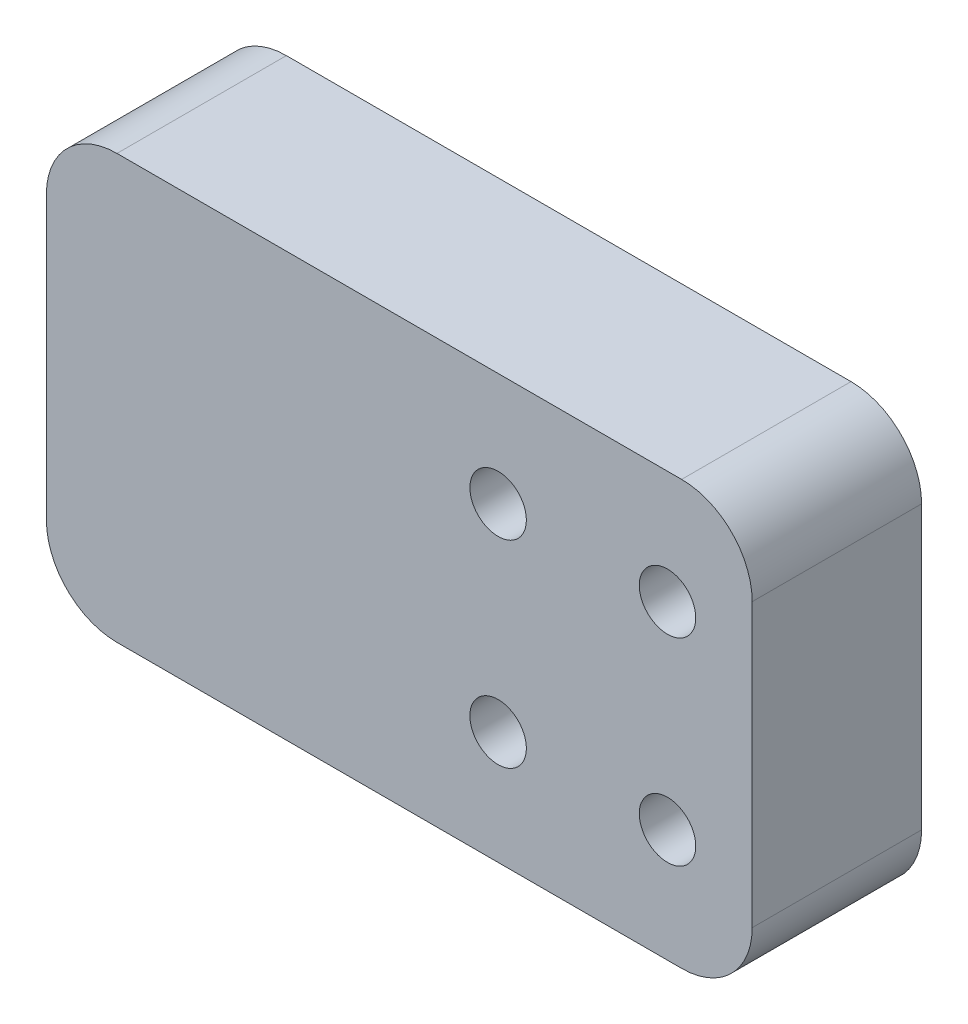
ISO-10303-21;
HEADER;
FILE_DESCRIPTION(('STEP AP214'),'2;1');
FILE_NAME('part.step','',(''),(''),'','','');
FILE_SCHEMA(('AUTOMOTIVE_DESIGN { 1 0 10303 214 1 1 1 1 }'));
ENDSEC;
DATA;
#1=APPLICATION_CONTEXT('core data for automotive mechanical design processes');
#2=APPLICATION_PROTOCOL_DEFINITION('international standard','automotive_design',2000,#1);
#3=PRODUCT_CONTEXT('',#1,'mechanical');
#4=PRODUCT('Part','Part','',(#3));
#5=PRODUCT_RELATED_PRODUCT_CATEGORY('part','',(#4));
#6=PRODUCT_DEFINITION_FORMATION('','',#4);
#7=PRODUCT_DEFINITION_CONTEXT('part definition',#1,'design');
#8=PRODUCT_DEFINITION('design','',#6,#7);
#9=PRODUCT_DEFINITION_SHAPE('','',#8);
#10=(LENGTH_UNIT() NAMED_UNIT(*) SI_UNIT(.MILLI.,.METRE.));
#11=(NAMED_UNIT(*) PLANE_ANGLE_UNIT() SI_UNIT($,.RADIAN.));
#12=(NAMED_UNIT(*) SI_UNIT($,.STERADIAN.) SOLID_ANGLE_UNIT());
#13=UNCERTAINTY_MEASURE_WITH_UNIT(LENGTH_MEASURE(1.E-05),#10,'distance_accuracy_value','');
#14=(GEOMETRIC_REPRESENTATION_CONTEXT(3) GLOBAL_UNCERTAINTY_ASSIGNED_CONTEXT((#13)) GLOBAL_UNIT_ASSIGNED_CONTEXT((#10,
#11,#12)) REPRESENTATION_CONTEXT('',''));
#15=CARTESIAN_POINT('',(0.,0.,0.));
#16=DIRECTION('',(0.,0.,1.));
#17=DIRECTION('',(1.,0.,0.));
#18=AXIS2_PLACEMENT_3D('',#15,#16,#17);
#19=CARTESIAN_POINT('',(0.,0.,-12.));
#20=DIRECTION('',(-1.,0.,0.));
#21=DIRECTION('',(0.,-1.,0.));
#22=AXIS2_PLACEMENT_3D('',#19,#20,#21);
#23=PLANE('',#22);
#24=DIRECTION('',(0.,-1.,0.));
#25=VECTOR('',#24,1.);
#26=CARTESIAN_POINT('',(0.,0.,-12.));
#27=LINE('',#26,#25);
#28=CARTESIAN_POINT('',(0.,25.,-12.));
#29=VERTEX_POINT('',#28);
#30=CARTESIAN_POINT('',(0.,5.,-12.));
#31=VERTEX_POINT('',#30);
#32=EDGE_CURVE('E172',#29,#31,#27,.T.);
#33=ORIENTED_EDGE('',*,*,#32,.T.);
#34=DIRECTION('',(0.,0.,1.));
#35=VECTOR('',#34,1.);
#36=CARTESIAN_POINT('',(0.,5.,-12.));
#37=LINE('',#36,#35);
#38=CARTESIAN_POINT('',(0.,5.,0.));
#39=VERTEX_POINT('',#38);
#40=EDGE_CURVE('E126',#31,#39,#37,.T.);
#41=ORIENTED_EDGE('',*,*,#40,.T.);
#42=DIRECTION('',(0.,-1.,0.));
#43=VECTOR('',#42,1.);
#44=CARTESIAN_POINT('',(0.,0.,0.));
#45=LINE('',#44,#43);
#46=CARTESIAN_POINT('',(0.,25.,0.));
#47=VERTEX_POINT('',#46);
#48=EDGE_CURVE('E110',#47,#39,#45,.T.);
#49=ORIENTED_EDGE('',*,*,#48,.F.);
#50=DIRECTION('',(0.,0.,1.));
#51=VECTOR('',#50,1.);
#52=CARTESIAN_POINT('',(0.,25.,-12.));
#53=LINE('',#52,#51);
#54=EDGE_CURVE('E123',#47,#29,#53,.F.);
#55=ORIENTED_EDGE('',*,*,#54,.T.);
#56=EDGE_LOOP('',(#33,#41,#49,#55));
#57=FACE_BOUND('',#56,.T.);
#58=ADVANCED_FACE('F41',(#57),#23,.T.);
#59=CARTESIAN_POINT('',(0.,30.,-12.));
#60=DIRECTION('',(0.,1.,0.));
#61=DIRECTION('',(0.,0.,1.));
#62=AXIS2_PLACEMENT_3D('',#59,#60,#61);
#63=PLANE('',#62);
#64=DIRECTION('',(-1.,0.,0.));
#65=VECTOR('',#64,1.);
#66=CARTESIAN_POINT('',(0.,30.,0.));
#67=LINE('',#66,#65);
#68=CARTESIAN_POINT('',(45.,30.,0.));
#69=VERTEX_POINT('',#68);
#70=CARTESIAN_POINT('',(4.99999999999999,30.,0.));
#71=VERTEX_POINT('',#70);
#72=EDGE_CURVE('E112',#69,#71,#67,.T.);
#73=ORIENTED_EDGE('',*,*,#72,.F.);
#74=DIRECTION('',(0.,0.,1.));
#75=VECTOR('',#74,1.);
#76=CARTESIAN_POINT('',(45.,30.,-12.));
#77=LINE('',#76,#75);
#78=CARTESIAN_POINT('',(45.,30.,-12.));
#79=VERTEX_POINT('',#78);
#80=EDGE_CURVE('E11',#69,#79,#77,.F.);
#81=ORIENTED_EDGE('',*,*,#80,.T.);
#82=DIRECTION('',(-1.,0.,0.));
#83=VECTOR('',#82,1.);
#84=CARTESIAN_POINT('',(0.,30.,-12.));
#85=LINE('',#84,#83);
#86=CARTESIAN_POINT('',(4.99999999999999,30.,-12.));
#87=VERTEX_POINT('',#86);
#88=EDGE_CURVE('E133',#79,#87,#85,.T.);
#89=ORIENTED_EDGE('',*,*,#88,.T.);
#90=DIRECTION('',(0.,0.,1.));
#91=VECTOR('',#90,1.);
#92=CARTESIAN_POINT('',(4.99999999999999,30.,-12.));
#93=LINE('',#92,#91);
#94=EDGE_CURVE('E49',#87,#71,#93,.T.);
#95=ORIENTED_EDGE('',*,*,#94,.T.);
#96=EDGE_LOOP('',(#73,#81,#89,#95));
#97=FACE_BOUND('',#96,.T.);
#98=ADVANCED_FACE('F161',(#97),#63,.T.);
#99=CARTESIAN_POINT('',(50.,0.,-12.));
#100=DIRECTION('',(1.,0.,0.));
#101=DIRECTION('',(0.,1.,0.));
#102=AXIS2_PLACEMENT_3D('',#99,#100,#101);
#103=PLANE('',#102);
#104=DIRECTION('',(0.,1.,0.));
#105=VECTOR('',#104,1.);
#106=CARTESIAN_POINT('',(50.,0.,-12.));
#107=LINE('',#106,#105);
#108=CARTESIAN_POINT('',(50.,5.,-12.));
#109=VERTEX_POINT('',#108);
#110=CARTESIAN_POINT('',(50.,25.,-12.));
#111=VERTEX_POINT('',#110);
#112=EDGE_CURVE('E137',#109,#111,#107,.T.);
#113=ORIENTED_EDGE('',*,*,#112,.T.);
#114=DIRECTION('',(0.,0.,1.));
#115=VECTOR('',#114,1.);
#116=CARTESIAN_POINT('',(50.,25.,-12.));
#117=LINE('',#116,#115);
#118=CARTESIAN_POINT('',(50.,25.,0.));
#119=VERTEX_POINT('',#118);
#120=EDGE_CURVE('E158',#111,#119,#117,.T.);
#121=ORIENTED_EDGE('',*,*,#120,.T.);
#122=DIRECTION('',(0.,1.,0.));
#123=VECTOR('',#122,1.);
#124=CARTESIAN_POINT('',(50.,0.,0.));
#125=LINE('',#124,#123);
#126=CARTESIAN_POINT('',(50.,5.,0.));
#127=VERTEX_POINT('',#126);
#128=EDGE_CURVE('E170',#127,#119,#125,.T.);
#129=ORIENTED_EDGE('',*,*,#128,.F.);
#130=DIRECTION('',(0.,0.,1.));
#131=VECTOR('',#130,1.);
#132=CARTESIAN_POINT('',(50.,5.,-12.));
#133=LINE('',#132,#131);
#134=EDGE_CURVE('E63',#127,#109,#133,.F.);
#135=ORIENTED_EDGE('',*,*,#134,.T.);
#136=EDGE_LOOP('',(#113,#121,#129,#135));
#137=FACE_BOUND('',#136,.T.);
#138=ADVANCED_FACE('F169',(#137),#103,.T.);
#139=CARTESIAN_POINT('',(0.,0.,-12.));
#140=DIRECTION('',(0.,-1.,0.));
#141=DIRECTION('',(0.,0.,-1.));
#142=AXIS2_PLACEMENT_3D('',#139,#140,#141);
#143=PLANE('',#142);
#144=DIRECTION('',(1.,0.,0.));
#145=VECTOR('',#144,1.);
#146=CARTESIAN_POINT('',(0.,0.,0.));
#147=LINE('',#146,#145);
#148=CARTESIAN_POINT('',(5.,0.,0.));
#149=VERTEX_POINT('',#148);
#150=CARTESIAN_POINT('',(45.,0.,0.));
#151=VERTEX_POINT('',#150);
#152=EDGE_CURVE('E127',#149,#151,#147,.T.);
#153=ORIENTED_EDGE('',*,*,#152,.F.);
#154=DIRECTION('',(0.,0.,1.));
#155=VECTOR('',#154,1.);
#156=CARTESIAN_POINT('',(5.,0.,-12.));
#157=LINE('',#156,#155);
#158=CARTESIAN_POINT('',(5.,0.,-12.));
#159=VERTEX_POINT('',#158);
#160=EDGE_CURVE('E149',#149,#159,#157,.F.);
#161=ORIENTED_EDGE('',*,*,#160,.T.);
#162=DIRECTION('',(1.,0.,0.));
#163=VECTOR('',#162,1.);
#164=CARTESIAN_POINT('',(0.,0.,-12.));
#165=LINE('',#164,#163);
#166=CARTESIAN_POINT('',(45.,0.,-12.));
#167=VERTEX_POINT('',#166);
#168=EDGE_CURVE('E176',#159,#167,#165,.T.);
#169=ORIENTED_EDGE('',*,*,#168,.T.);
#170=DIRECTION('',(0.,0.,1.));
#171=VECTOR('',#170,1.);
#172=CARTESIAN_POINT('',(45.,0.,-12.));
#173=LINE('',#172,#171);
#174=EDGE_CURVE('E146',#167,#151,#173,.T.);
#175=ORIENTED_EDGE('',*,*,#174,.T.);
#176=EDGE_LOOP('',(#153,#161,#169,#175));
#177=FACE_BOUND('',#176,.T.);
#178=ADVANCED_FACE('F234',(#177),#143,.T.);
#179=CARTESIAN_POINT('',(0.,0.,-12.));
#180=DIRECTION('',(0.,0.,-1.));
#181=DIRECTION('',(-1.,0.,0.));
#182=AXIS2_PLACEMENT_3D('',#179,#180,#181);
#183=PLANE('',#182);
#184=CARTESIAN_POINT('',(44.,8.,-12.));
#185=DIRECTION('',(0.,0.,1.));
#186=DIRECTION('',(-1.,0.,0.));
#187=AXIS2_PLACEMENT_3D('',#184,#185,#186);
#188=CIRCLE('',#187,2.);
#189=CARTESIAN_POINT('',(42.,8.,-12.));
#190=VERTEX_POINT('',#189);
#191=EDGE_CURVE('E193',#190,#190,#188,.T.);
#192=ORIENTED_EDGE('',*,*,#191,.T.);
#193=EDGE_LOOP('',(#192));
#194=FACE_BOUND('',#193,.T.);
#195=CARTESIAN_POINT('',(32.,21.9999999999999,-12.));
#196=DIRECTION('',(0.,0.,1.));
#197=DIRECTION('',(1.,0.,0.));
#198=AXIS2_PLACEMENT_3D('',#195,#196,#197);
#199=CIRCLE('',#198,2.);
#200=CARTESIAN_POINT('',(34.,21.9999999999999,-12.));
#201=VERTEX_POINT('',#200);
#202=EDGE_CURVE('E186',#201,#201,#199,.T.);
#203=ORIENTED_EDGE('',*,*,#202,.T.);
#204=EDGE_LOOP('',(#203));
#205=FACE_BOUND('',#204,.T.);
#206=CARTESIAN_POINT('',(32.,7.99999999999992,-12.));
#207=DIRECTION('',(0.,0.,1.));
#208=DIRECTION('',(-1.,0.,0.));
#209=AXIS2_PLACEMENT_3D('',#206,#207,#208);
#210=CIRCLE('',#209,2.);
#211=CARTESIAN_POINT('',(30.,7.99999999999992,-12.));
#212=VERTEX_POINT('',#211);
#213=EDGE_CURVE('E198',#212,#212,#210,.T.);
#214=ORIENTED_EDGE('',*,*,#213,.T.);
#215=EDGE_LOOP('',(#214));
#216=FACE_BOUND('',#215,.T.);
#217=CARTESIAN_POINT('',(44.,22.,-12.));
#218=DIRECTION('',(0.,0.,1.));
#219=DIRECTION('',(1.,0.,0.));
#220=AXIS2_PLACEMENT_3D('',#217,#218,#219);
#221=CIRCLE('',#220,2.);
#222=CARTESIAN_POINT('',(46.,22.,-12.));
#223=VERTEX_POINT('',#222);
#224=EDGE_CURVE('E128',#223,#223,#221,.T.);
#225=ORIENTED_EDGE('',*,*,#224,.T.);
#226=EDGE_LOOP('',(#225));
#227=FACE_BOUND('',#226,.T.);
#228=ORIENTED_EDGE('',*,*,#168,.F.);
#229=CARTESIAN_POINT('',(5.,5.,-12.));
#230=DIRECTION('',(0.,0.,-1.));
#231=DIRECTION('',(-1.,0.,0.));
#232=AXIS2_PLACEMENT_3D('',#229,#230,#231);
#233=CIRCLE('',#232,5.);
#234=EDGE_CURVE('E155',#159,#31,#233,.T.);
#235=ORIENTED_EDGE('',*,*,#234,.T.);
#236=ORIENTED_EDGE('',*,*,#32,.F.);
#237=CARTESIAN_POINT('',(4.99999999999999,25.,-12.));
#238=DIRECTION('',(0.,0.,-1.));
#239=DIRECTION('',(-1.,0.,0.));
#240=AXIS2_PLACEMENT_3D('',#237,#238,#239);
#241=CIRCLE('',#240,5.);
#242=EDGE_CURVE('E132',#29,#87,#241,.T.);
#243=ORIENTED_EDGE('',*,*,#242,.T.);
#244=ORIENTED_EDGE('',*,*,#88,.F.);
#245=CARTESIAN_POINT('',(45.,25.,-12.));
#246=DIRECTION('',(0.,0.,-1.));
#247=DIRECTION('',(-1.,0.,0.));
#248=AXIS2_PLACEMENT_3D('',#245,#246,#247);
#249=CIRCLE('',#248,5.);
#250=EDGE_CURVE('E56',#79,#111,#249,.T.);
#251=ORIENTED_EDGE('',*,*,#250,.T.);
#252=ORIENTED_EDGE('',*,*,#112,.F.);
#253=CARTESIAN_POINT('',(45.,5.,-12.));
#254=DIRECTION('',(0.,0.,-1.));
#255=DIRECTION('',(-1.,0.,0.));
#256=AXIS2_PLACEMENT_3D('',#253,#254,#255);
#257=CIRCLE('',#256,5.);
#258=EDGE_CURVE('E151',#109,#167,#257,.T.);
#259=ORIENTED_EDGE('',*,*,#258,.T.);
#260=EDGE_LOOP('',(#228,#235,#236,#243,#244,#251,#252,#259));
#261=FACE_BOUND('',#260,.T.);
#262=ADVANCED_FACE('F164',(#194,#205,#216,#227,#261),#183,.T.);
#263=CARTESIAN_POINT('',(0.,0.,0.));
#264=DIRECTION('',(0.,0.,-1.));
#265=DIRECTION('',(-1.,0.,0.));
#266=AXIS2_PLACEMENT_3D('',#263,#264,#265);
#267=PLANE('',#266);
#268=CARTESIAN_POINT('',(44.,8.,0.));
#269=DIRECTION('',(0.,0.,1.));
#270=DIRECTION('',(-1.,0.,0.));
#271=AXIS2_PLACEMENT_3D('',#268,#269,#270);
#272=CIRCLE('',#271,2.);
#273=CARTESIAN_POINT('',(42.,8.,0.));
#274=VERTEX_POINT('',#273);
#275=EDGE_CURVE('E183',#274,#274,#272,.T.);
#276=ORIENTED_EDGE('',*,*,#275,.F.);
#277=EDGE_LOOP('',(#276));
#278=FACE_BOUND('',#277,.T.);
#279=CARTESIAN_POINT('',(32.,21.9999999999999,0.));
#280=DIRECTION('',(0.,0.,1.));
#281=DIRECTION('',(1.,0.,0.));
#282=AXIS2_PLACEMENT_3D('',#279,#280,#281);
#283=CIRCLE('',#282,2.);
#284=CARTESIAN_POINT('',(34.,21.9999999999999,0.));
#285=VERTEX_POINT('',#284);
#286=EDGE_CURVE('E189',#285,#285,#283,.T.);
#287=ORIENTED_EDGE('',*,*,#286,.F.);
#288=EDGE_LOOP('',(#287));
#289=FACE_BOUND('',#288,.T.);
#290=CARTESIAN_POINT('',(32.,7.99999999999992,0.));
#291=DIRECTION('',(0.,0.,1.));
#292=DIRECTION('',(-1.,0.,0.));
#293=AXIS2_PLACEMENT_3D('',#290,#291,#292);
#294=CIRCLE('',#293,2.);
#295=CARTESIAN_POINT('',(30.,7.99999999999992,0.));
#296=VERTEX_POINT('',#295);
#297=EDGE_CURVE('E190',#296,#296,#294,.T.);
#298=ORIENTED_EDGE('',*,*,#297,.F.);
#299=EDGE_LOOP('',(#298));
#300=FACE_BOUND('',#299,.T.);
#301=CARTESIAN_POINT('',(44.,22.,0.));
#302=DIRECTION('',(0.,0.,1.));
#303=DIRECTION('',(1.,0.,0.));
#304=AXIS2_PLACEMENT_3D('',#301,#302,#303);
#305=CIRCLE('',#304,2.);
#306=CARTESIAN_POINT('',(46.,22.,0.));
#307=VERTEX_POINT('',#306);
#308=EDGE_CURVE('E180',#307,#307,#305,.T.);
#309=ORIENTED_EDGE('',*,*,#308,.F.);
#310=EDGE_LOOP('',(#309));
#311=FACE_BOUND('',#310,.T.);
#312=ORIENTED_EDGE('',*,*,#48,.T.);
#313=CARTESIAN_POINT('',(5.,5.,0.));
#314=DIRECTION('',(0.,0.,-1.));
#315=DIRECTION('',(-1.,0.,0.));
#316=AXIS2_PLACEMENT_3D('',#313,#314,#315);
#317=CIRCLE('',#316,5.);
#318=EDGE_CURVE('E144',#39,#149,#317,.F.);
#319=ORIENTED_EDGE('',*,*,#318,.T.);
#320=ORIENTED_EDGE('',*,*,#152,.T.);
#321=CARTESIAN_POINT('',(45.,5.,0.));
#322=DIRECTION('',(0.,0.,-1.));
#323=DIRECTION('',(-1.,0.,0.));
#324=AXIS2_PLACEMENT_3D('',#321,#322,#323);
#325=CIRCLE('',#324,5.);
#326=EDGE_CURVE('E118',#151,#127,#325,.F.);
#327=ORIENTED_EDGE('',*,*,#326,.T.);
#328=ORIENTED_EDGE('',*,*,#128,.T.);
#329=CARTESIAN_POINT('',(45.,25.,0.));
#330=DIRECTION('',(0.,0.,-1.));
#331=DIRECTION('',(-1.,0.,0.));
#332=AXIS2_PLACEMENT_3D('',#329,#330,#331);
#333=CIRCLE('',#332,5.);
#334=EDGE_CURVE('E117',#119,#69,#333,.F.);
#335=ORIENTED_EDGE('',*,*,#334,.T.);
#336=ORIENTED_EDGE('',*,*,#72,.T.);
#337=CARTESIAN_POINT('',(4.99999999999999,25.,0.));
#338=DIRECTION('',(0.,0.,-1.));
#339=DIRECTION('',(-1.,0.,0.));
#340=AXIS2_PLACEMENT_3D('',#337,#338,#339);
#341=CIRCLE('',#340,5.);
#342=EDGE_CURVE('E107',#71,#47,#341,.F.);
#343=ORIENTED_EDGE('',*,*,#342,.T.);
#344=EDGE_LOOP('',(#312,#319,#320,#327,#328,#335,#336,#343));
#345=FACE_BOUND('',#344,.T.);
#346=ADVANCED_FACE('F109',(#278,#289,#300,#311,#345),#267,.F.);
#347=CARTESIAN_POINT('',(44.,22.,-12.));
#348=DIRECTION('',(0.,0.,1.));
#349=DIRECTION('',(1.,0.,0.));
#350=AXIS2_PLACEMENT_3D('',#347,#348,#349);
#351=CYLINDRICAL_SURFACE('',#350,2.);
#352=ORIENTED_EDGE('',*,*,#224,.F.);
#353=EDGE_LOOP('',(#352));
#354=FACE_BOUND('',#353,.T.);
#355=ORIENTED_EDGE('',*,*,#308,.T.);
#356=EDGE_LOOP('',(#355));
#357=FACE_BOUND('',#356,.T.);
#358=ADVANCED_FACE('F208',(#354,#357),#351,.F.);
#359=CARTESIAN_POINT('',(32.,7.99999999999992,-12.));
#360=DIRECTION('',(0.,0.,1.));
#361=DIRECTION('',(1.,0.,0.));
#362=AXIS2_PLACEMENT_3D('',#359,#360,#361);
#363=CYLINDRICAL_SURFACE('',#362,2.);
#364=ORIENTED_EDGE('',*,*,#213,.F.);
#365=EDGE_LOOP('',(#364));
#366=FACE_BOUND('',#365,.T.);
#367=ORIENTED_EDGE('',*,*,#297,.T.);
#368=EDGE_LOOP('',(#367));
#369=FACE_BOUND('',#368,.T.);
#370=ADVANCED_FACE('F204',(#366,#369),#363,.F.);
#371=CARTESIAN_POINT('',(32.,21.9999999999999,-12.));
#372=DIRECTION('',(0.,0.,1.));
#373=DIRECTION('',(1.,0.,0.));
#374=AXIS2_PLACEMENT_3D('',#371,#372,#373);
#375=CYLINDRICAL_SURFACE('',#374,2.);
#376=ORIENTED_EDGE('',*,*,#202,.F.);
#377=EDGE_LOOP('',(#376));
#378=FACE_BOUND('',#377,.T.);
#379=ORIENTED_EDGE('',*,*,#286,.T.);
#380=EDGE_LOOP('',(#379));
#381=FACE_BOUND('',#380,.T.);
#382=ADVANCED_FACE('F219',(#378,#381),#375,.F.);
#383=CARTESIAN_POINT('',(44.,8.,-12.));
#384=DIRECTION('',(0.,0.,1.));
#385=DIRECTION('',(1.,0.,0.));
#386=AXIS2_PLACEMENT_3D('',#383,#384,#385);
#387=CYLINDRICAL_SURFACE('',#386,2.);
#388=ORIENTED_EDGE('',*,*,#191,.F.);
#389=EDGE_LOOP('',(#388));
#390=FACE_BOUND('',#389,.T.);
#391=ORIENTED_EDGE('',*,*,#275,.T.);
#392=EDGE_LOOP('',(#391));
#393=FACE_BOUND('',#392,.T.);
#394=ADVANCED_FACE('F239',(#390,#393),#387,.F.);
#395=CARTESIAN_POINT('',(5.,5.,-12.));
#396=DIRECTION('',(0.,0.,1.));
#397=DIRECTION('',(1.,0.,0.));
#398=AXIS2_PLACEMENT_3D('',#395,#396,#397);
#399=CYLINDRICAL_SURFACE('',#398,5.);
#400=ORIENTED_EDGE('',*,*,#234,.F.);
#401=ORIENTED_EDGE('',*,*,#160,.F.);
#402=ORIENTED_EDGE('',*,*,#318,.F.);
#403=ORIENTED_EDGE('',*,*,#40,.F.);
#404=EDGE_LOOP('',(#400,#401,#402,#403));
#405=FACE_BOUND('',#404,.T.);
#406=ADVANCED_FACE('F236',(#405),#399,.T.);
#407=CARTESIAN_POINT('',(45.,25.,-12.));
#408=DIRECTION('',(0.,0.,1.));
#409=DIRECTION('',(1.,0.,0.));
#410=AXIS2_PLACEMENT_3D('',#407,#408,#409);
#411=CYLINDRICAL_SURFACE('',#410,5.);
#412=ORIENTED_EDGE('',*,*,#250,.F.);
#413=ORIENTED_EDGE('',*,*,#80,.F.);
#414=ORIENTED_EDGE('',*,*,#334,.F.);
#415=ORIENTED_EDGE('',*,*,#120,.F.);
#416=EDGE_LOOP('',(#412,#413,#414,#415));
#417=FACE_BOUND('',#416,.T.);
#418=ADVANCED_FACE('F167',(#417),#411,.T.);
#419=CARTESIAN_POINT('',(4.99999999999999,25.,-12.));
#420=DIRECTION('',(0.,0.,1.));
#421=DIRECTION('',(1.,0.,0.));
#422=AXIS2_PLACEMENT_3D('',#419,#420,#421);
#423=CYLINDRICAL_SURFACE('',#422,5.);
#424=ORIENTED_EDGE('',*,*,#242,.F.);
#425=ORIENTED_EDGE('',*,*,#54,.F.);
#426=ORIENTED_EDGE('',*,*,#342,.F.);
#427=ORIENTED_EDGE('',*,*,#94,.F.);
#428=EDGE_LOOP('',(#424,#425,#426,#427));
#429=FACE_BOUND('',#428,.T.);
#430=ADVANCED_FACE('F131',(#429),#423,.T.);
#431=CARTESIAN_POINT('',(45.,5.,-12.));
#432=DIRECTION('',(0.,0.,1.));
#433=DIRECTION('',(1.,0.,0.));
#434=AXIS2_PLACEMENT_3D('',#431,#432,#433);
#435=CYLINDRICAL_SURFACE('',#434,5.);
#436=ORIENTED_EDGE('',*,*,#258,.F.);
#437=ORIENTED_EDGE('',*,*,#134,.F.);
#438=ORIENTED_EDGE('',*,*,#326,.F.);
#439=ORIENTED_EDGE('',*,*,#174,.F.);
#440=EDGE_LOOP('',(#436,#437,#438,#439));
#441=FACE_BOUND('',#440,.T.);
#442=ADVANCED_FACE('F43',(#441),#435,.T.);
#443=CLOSED_SHELL('',(#58,#98,#138,#178,#262,#346,#358,#370,#382,#394,#406,#418,#430,#442));
#444=MANIFOLD_SOLID_BREP('B2',#443);
#445=ADVANCED_BREP_SHAPE_REPRESENTATION('',(#18,#444),#14);
#446=SHAPE_DEFINITION_REPRESENTATION(#9,#445);
ENDSEC;
END-ISO-10303-21;
